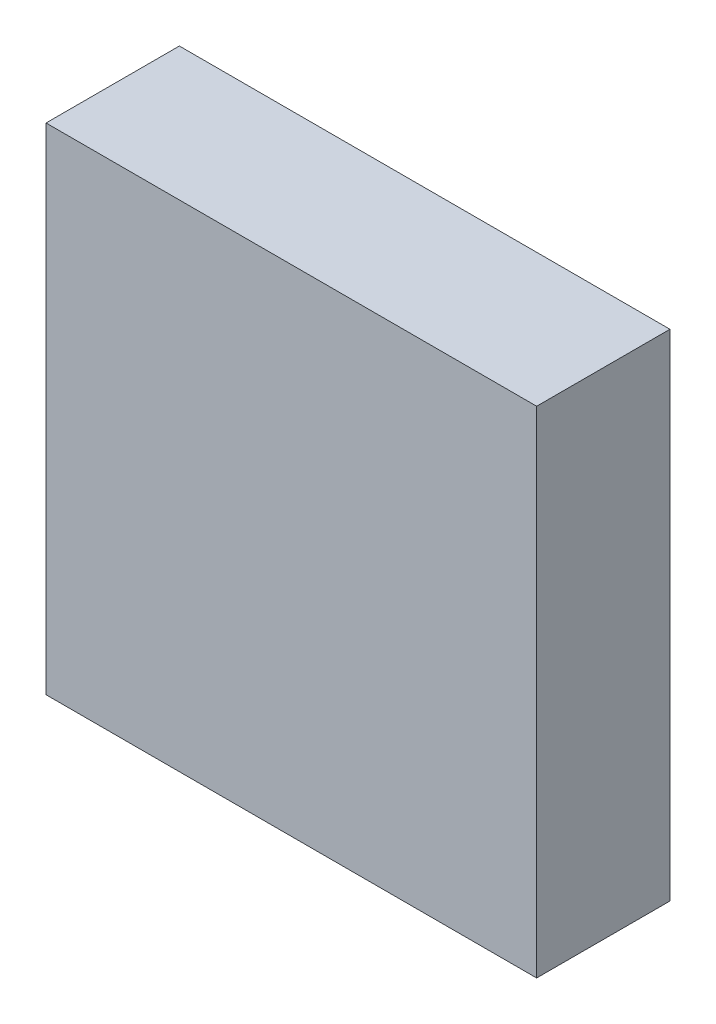
ISO-10303-21;
HEADER;
FILE_DESCRIPTION(('STEP AP214'),'2;1');
FILE_NAME('part.step','',(''),(''),'','','');
FILE_SCHEMA(('AUTOMOTIVE_DESIGN { 1 0 10303 214 1 1 1 1 }'));
ENDSEC;
DATA;
#1=APPLICATION_CONTEXT('core data for automotive mechanical design processes');
#2=APPLICATION_PROTOCOL_DEFINITION('international standard','automotive_design',2000,#1);
#3=PRODUCT_CONTEXT('',#1,'mechanical');
#4=PRODUCT('Part','Part','',(#3));
#5=PRODUCT_RELATED_PRODUCT_CATEGORY('part','',(#4));
#6=PRODUCT_DEFINITION_FORMATION('','',#4);
#7=PRODUCT_DEFINITION_CONTEXT('part definition',#1,'design');
#8=PRODUCT_DEFINITION('design','',#6,#7);
#9=PRODUCT_DEFINITION_SHAPE('','',#8);
#10=(LENGTH_UNIT() NAMED_UNIT(*) SI_UNIT(.MILLI.,.METRE.));
#11=(NAMED_UNIT(*) PLANE_ANGLE_UNIT() SI_UNIT($,.RADIAN.));
#12=(NAMED_UNIT(*) SI_UNIT($,.STERADIAN.) SOLID_ANGLE_UNIT());
#13=UNCERTAINTY_MEASURE_WITH_UNIT(LENGTH_MEASURE(1.E-05),#10,'distance_accuracy_value','');
#14=(GEOMETRIC_REPRESENTATION_CONTEXT(3) GLOBAL_UNCERTAINTY_ASSIGNED_CONTEXT((#13)) GLOBAL_UNIT_ASSIGNED_CONTEXT((#10,
#11,#12)) REPRESENTATION_CONTEXT('',''));
#15=CARTESIAN_POINT('',(0.,0.,0.));
#16=DIRECTION('',(0.,0.,1.));
#17=DIRECTION('',(1.,0.,0.));
#18=AXIS2_PLACEMENT_3D('',#15,#16,#17);
#19=CARTESIAN_POINT('',(-3.2200088,-3.25000366,1.74999904));
#20=DIRECTION('',(0.,0.,1.));
#21=DIRECTION('',(1.,0.,0.));
#22=AXIS2_PLACEMENT_3D('',#19,#20,#21);
#23=PLANE('',#22);
#24=DIRECTION('',(1.,0.,0.));
#25=VECTOR('',#24,1.);
#26=CARTESIAN_POINT('',(-3.21999864,3.25000366,1.74999904));
#27=LINE('',#26,#25);
#28=CARTESIAN_POINT('',(-3.2200088,3.25000366,1.74999904));
#29=VERTEX_POINT('',#28);
#30=CARTESIAN_POINT('',(3.2200088,3.25000366,1.74999904));
#31=VERTEX_POINT('',#30);
#32=EDGE_CURVE('E99',#29,#31,#27,.T.);
#33=ORIENTED_EDGE('',*,*,#32,.F.);
#34=DIRECTION('',(0.,1.,0.));
#35=VECTOR('',#34,1.);
#36=CARTESIAN_POINT('',(-3.2200088,-3.25000366,1.74999904));
#37=LINE('',#36,#35);
#38=CARTESIAN_POINT('',(-3.2200088,-3.25000366,1.74999904));
#39=VERTEX_POINT('',#38);
#40=EDGE_CURVE('E57',#39,#29,#37,.T.);
#41=ORIENTED_EDGE('',*,*,#40,.F.);
#42=DIRECTION('',(0.999999999998756,-1.57763544034161E-06,0.));
#43=VECTOR('',#42,1.);
#44=CARTESIAN_POINT('',(3.2200088,-3.25001382,1.74999904));
#45=LINE('',#44,#43);
#46=CARTESIAN_POINT('',(3.2200088,-3.25001382,1.74999904));
#47=VERTEX_POINT('',#46);
#48=EDGE_CURVE('E74',#47,#39,#45,.F.);
#49=ORIENTED_EDGE('',*,*,#48,.F.);
#50=DIRECTION('',(0.,1.,0.));
#51=VECTOR('',#50,1.);
#52=CARTESIAN_POINT('',(3.2200088,3.25000366,1.74999904));
#53=LINE('',#52,#51);
#54=EDGE_CURVE('E100',#31,#47,#53,.F.);
#55=ORIENTED_EDGE('',*,*,#54,.F.);
#56=EDGE_LOOP('',(#33,#41,#49,#55));
#57=FACE_BOUND('',#56,.T.);
#58=ADVANCED_FACE('F17',(#57),#23,.T.);
#59=CARTESIAN_POINT('',(3.2200088,-3.25001382,0.));
#60=DIRECTION('',(-1.57763544034161E-06,-0.999999999998756,0.));
#61=DIRECTION('',(0.999999999998756,-1.57763544034161E-06,0.));
#62=AXIS2_PLACEMENT_3D('',#59,#60,#61);
#63=PLANE('',#62);
#64=DIRECTION('',(0.,0.,1.));
#65=VECTOR('',#64,1.);
#66=CARTESIAN_POINT('',(-3.2200088,-3.25000366,0.));
#67=LINE('',#66,#65);
#68=CARTESIAN_POINT('',(-3.2200088,-3.25000366,0.));
#69=VERTEX_POINT('',#68);
#70=EDGE_CURVE('E71',#69,#39,#67,.T.);
#71=ORIENTED_EDGE('',*,*,#70,.F.);
#72=DIRECTION('',(0.999999999998756,-1.57763544002675E-06,0.));
#73=VECTOR('',#72,1.);
#74=CARTESIAN_POINT('',(-3.2200088,-3.25000366,0.));
#75=LINE('',#74,#73);
#76=CARTESIAN_POINT('',(3.2200088,-3.25001382,0.));
#77=VERTEX_POINT('',#76);
#78=EDGE_CURVE('E63',#69,#77,#75,.T.);
#79=ORIENTED_EDGE('',*,*,#78,.T.);
#80=DIRECTION('',(0.,0.,-1.));
#81=VECTOR('',#80,1.);
#82=CARTESIAN_POINT('',(3.2200088,-3.25001382,0.));
#83=LINE('',#82,#81);
#84=EDGE_CURVE('E101',#47,#77,#83,.T.);
#85=ORIENTED_EDGE('',*,*,#84,.F.);
#86=ORIENTED_EDGE('',*,*,#48,.T.);
#87=EDGE_LOOP('',(#71,#79,#85,#86));
#88=FACE_BOUND('',#87,.T.);
#89=ADVANCED_FACE('F72',(#88),#63,.T.);
#90=CARTESIAN_POINT('',(3.2200088,3.25000366,0.));
#91=DIRECTION('',(1.,0.,0.));
#92=DIRECTION('',(0.,0.,-1.));
#93=AXIS2_PLACEMENT_3D('',#90,#91,#92);
#94=PLANE('',#93);
#95=ORIENTED_EDGE('',*,*,#84,.T.);
#96=DIRECTION('',(0.,1.,0.));
#97=VECTOR('',#96,1.);
#98=CARTESIAN_POINT('',(3.2200088,-3.25000366,0.));
#99=LINE('',#98,#97);
#100=CARTESIAN_POINT('',(3.2200088,3.25000366,0.));
#101=VERTEX_POINT('',#100);
#102=EDGE_CURVE('E67',#77,#101,#99,.T.);
#103=ORIENTED_EDGE('',*,*,#102,.T.);
#104=DIRECTION('',(0.,0.,1.));
#105=VECTOR('',#104,1.);
#106=CARTESIAN_POINT('',(3.2200088,3.25000366,0.));
#107=LINE('',#106,#105);
#108=EDGE_CURVE('E40',#31,#101,#107,.F.);
#109=ORIENTED_EDGE('',*,*,#108,.F.);
#110=ORIENTED_EDGE('',*,*,#54,.T.);
#111=EDGE_LOOP('',(#95,#103,#109,#110));
#112=FACE_BOUND('',#111,.T.);
#113=ADVANCED_FACE('F86',(#112),#94,.T.);
#114=CARTESIAN_POINT('',(-3.21999864,3.25000366,0.));
#115=DIRECTION('',(0.,1.,0.));
#116=DIRECTION('',(0.,0.,1.));
#117=AXIS2_PLACEMENT_3D('',#114,#115,#116);
#118=PLANE('',#117);
#119=ORIENTED_EDGE('',*,*,#108,.T.);
#120=DIRECTION('',(1.,0.,0.));
#121=VECTOR('',#120,1.);
#122=CARTESIAN_POINT('',(-3.2200088,3.25000366,0.));
#123=LINE('',#122,#121);
#124=CARTESIAN_POINT('',(-3.2200088,3.25000366,0.));
#125=VERTEX_POINT('',#124);
#126=EDGE_CURVE('E25',#101,#125,#123,.F.);
#127=ORIENTED_EDGE('',*,*,#126,.T.);
#128=DIRECTION('',(0.,0.,-1.));
#129=VECTOR('',#128,1.);
#130=CARTESIAN_POINT('',(-3.2200088,3.25000366,0.));
#131=LINE('',#130,#129);
#132=EDGE_CURVE('E20',#29,#125,#131,.T.);
#133=ORIENTED_EDGE('',*,*,#132,.F.);
#134=ORIENTED_EDGE('',*,*,#32,.T.);
#135=EDGE_LOOP('',(#119,#127,#133,#134));
#136=FACE_BOUND('',#135,.T.);
#137=ADVANCED_FACE('F78',(#136),#118,.T.);
#138=CARTESIAN_POINT('',(-3.2200088,-3.25000366,0.));
#139=DIRECTION('',(-1.,0.,0.));
#140=DIRECTION('',(0.,0.,1.));
#141=AXIS2_PLACEMENT_3D('',#138,#139,#140);
#142=PLANE('',#141);
#143=ORIENTED_EDGE('',*,*,#132,.T.);
#144=DIRECTION('',(0.,1.,0.));
#145=VECTOR('',#144,1.);
#146=CARTESIAN_POINT('',(-3.2200088,-3.25000366,0.));
#147=LINE('',#146,#145);
#148=EDGE_CURVE('E11',#125,#69,#147,.F.);
#149=ORIENTED_EDGE('',*,*,#148,.T.);
#150=ORIENTED_EDGE('',*,*,#70,.T.);
#151=ORIENTED_EDGE('',*,*,#40,.T.);
#152=EDGE_LOOP('',(#143,#149,#150,#151));
#153=FACE_BOUND('',#152,.T.);
#154=ADVANCED_FACE('F76',(#153),#142,.T.);
#155=CARTESIAN_POINT('',(-3.2200088,-3.25000366,0.));
#156=DIRECTION('',(0.,0.,1.));
#157=DIRECTION('',(1.,0.,0.));
#158=AXIS2_PLACEMENT_3D('',#155,#156,#157);
#159=PLANE('',#158);
#160=ORIENTED_EDGE('',*,*,#126,.F.);
#161=ORIENTED_EDGE('',*,*,#102,.F.);
#162=ORIENTED_EDGE('',*,*,#78,.F.);
#163=ORIENTED_EDGE('',*,*,#148,.F.);
#164=EDGE_LOOP('',(#160,#161,#162,#163));
#165=FACE_BOUND('',#164,.T.);
#166=ADVANCED_FACE('F65',(#165),#159,.F.);
#167=CLOSED_SHELL('',(#58,#89,#113,#137,#154,#166));
#168=MANIFOLD_SOLID_BREP('B1',#167);
#169=ADVANCED_BREP_SHAPE_REPRESENTATION('',(#18,#168),#14);
#170=SHAPE_DEFINITION_REPRESENTATION(#9,#169);
ENDSEC;
END-ISO-10303-21;
